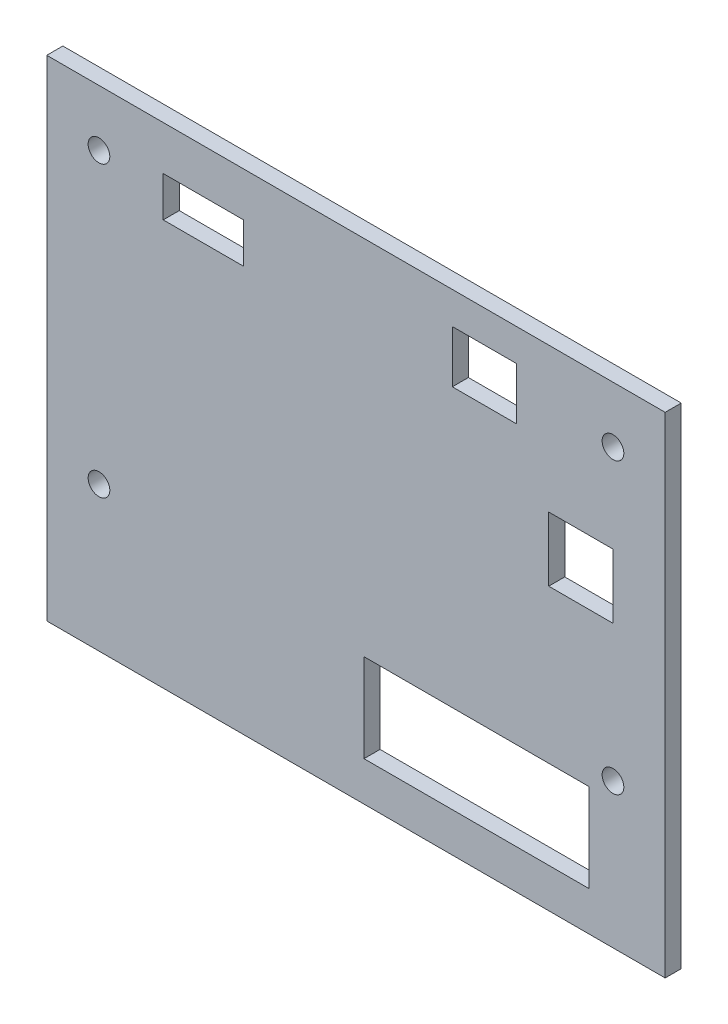
ISO-10303-21;
HEADER;
FILE_DESCRIPTION(('STEP AP214'),'2;1');
FILE_NAME('part.step','',(''),(''),'','','');
FILE_SCHEMA(('AUTOMOTIVE_DESIGN { 1 0 10303 214 1 1 1 1 }'));
ENDSEC;
DATA;
#1=APPLICATION_CONTEXT('core data for automotive mechanical design processes');
#2=APPLICATION_PROTOCOL_DEFINITION('international standard','automotive_design',2000,#1);
#3=PRODUCT_CONTEXT('',#1,'mechanical');
#4=PRODUCT('Part','Part','',(#3));
#5=PRODUCT_RELATED_PRODUCT_CATEGORY('part','',(#4));
#6=PRODUCT_DEFINITION_FORMATION('','',#4);
#7=PRODUCT_DEFINITION_CONTEXT('part definition',#1,'design');
#8=PRODUCT_DEFINITION('design','',#6,#7);
#9=PRODUCT_DEFINITION_SHAPE('','',#8);
#10=(LENGTH_UNIT() NAMED_UNIT(*) SI_UNIT(.MILLI.,.METRE.));
#11=(NAMED_UNIT(*) PLANE_ANGLE_UNIT() SI_UNIT($,.RADIAN.));
#12=(NAMED_UNIT(*) SI_UNIT($,.STERADIAN.) SOLID_ANGLE_UNIT());
#13=UNCERTAINTY_MEASURE_WITH_UNIT(LENGTH_MEASURE(1.E-05),#10,'distance_accuracy_value','');
#14=(GEOMETRIC_REPRESENTATION_CONTEXT(3) GLOBAL_UNCERTAINTY_ASSIGNED_CONTEXT((#13)) GLOBAL_UNIT_ASSIGNED_CONTEXT((#10,
#11,#12)) REPRESENTATION_CONTEXT('',''));
#15=CARTESIAN_POINT('',(0.,0.,0.));
#16=DIRECTION('',(0.,0.,1.));
#17=DIRECTION('',(1.,0.,0.));
#18=AXIS2_PLACEMENT_3D('',#15,#16,#17);
#19=CARTESIAN_POINT('',(0.,0.,2.));
#20=DIRECTION('',(0.,0.,-1.));
#21=DIRECTION('',(-1.,0.,0.));
#22=AXIS2_PLACEMENT_3D('',#19,#20,#21);
#23=PLANE('',#22);
#24=CARTESIAN_POINT('',(70.5,18.,2.));
#25=DIRECTION('',(0.,0.,1.));
#26=DIRECTION('',(1.,0.,0.));
#27=AXIS2_PLACEMENT_3D('',#24,#25,#26);
#28=CIRCLE('',#27,1.35000000000001);
#29=CARTESIAN_POINT('',(71.85,18.,2.));
#30=VERTEX_POINT('',#29);
#31=EDGE_CURVE('E484',#30,#30,#28,.T.);
#32=ORIENTED_EDGE('',*,*,#31,.F.);
#33=EDGE_LOOP('',(#32));
#34=FACE_BOUND('',#33,.T.);
#35=CARTESIAN_POINT('',(6.5,54.,2.));
#36=DIRECTION('',(0.,0.,1.));
#37=DIRECTION('',(1.,0.,0.));
#38=AXIS2_PLACEMENT_3D('',#35,#36,#37);
#39=CIRCLE('',#38,1.35);
#40=CARTESIAN_POINT('',(7.85,54.,2.));
#41=VERTEX_POINT('',#40);
#42=EDGE_CURVE('E473',#41,#41,#39,.T.);
#43=ORIENTED_EDGE('',*,*,#42,.F.);
#44=EDGE_LOOP('',(#43));
#45=FACE_BOUND('',#44,.T.);
#46=CARTESIAN_POINT('',(70.5,54.,2.));
#47=DIRECTION('',(0.,0.,1.));
#48=DIRECTION('',(1.,0.,0.));
#49=AXIS2_PLACEMENT_3D('',#46,#47,#48);
#50=CIRCLE('',#49,1.35000000000001);
#51=CARTESIAN_POINT('',(71.85,54.,2.));
#52=VERTEX_POINT('',#51);
#53=EDGE_CURVE('E468',#52,#52,#50,.T.);
#54=ORIENTED_EDGE('',*,*,#53,.F.);
#55=EDGE_LOOP('',(#54));
#56=FACE_BOUND('',#55,.T.);
#57=CARTESIAN_POINT('',(6.5,18.,2.));
#58=DIRECTION('',(0.,0.,1.));
#59=DIRECTION('',(1.,0.,0.));
#60=AXIS2_PLACEMENT_3D('',#57,#58,#59);
#61=CIRCLE('',#60,1.35);
#62=CARTESIAN_POINT('',(7.85,18.,2.));
#63=VERTEX_POINT('',#62);
#64=EDGE_CURVE('E251',#63,#63,#61,.T.);
#65=ORIENTED_EDGE('',*,*,#64,.F.);
#66=EDGE_LOOP('',(#65));
#67=FACE_BOUND('',#66,.T.);
#68=DIRECTION('',(0.,-1.,0.));
#69=VECTOR('',#68,1.);
#70=CARTESIAN_POINT('',(50.5,50.5,2.));
#71=LINE('',#70,#69);
#72=CARTESIAN_POINT('',(50.5,57.,2.));
#73=VERTEX_POINT('',#72);
#74=CARTESIAN_POINT('',(50.5,50.5,2.));
#75=VERTEX_POINT('',#74);
#76=EDGE_CURVE('E233',#73,#75,#71,.T.);
#77=ORIENTED_EDGE('',*,*,#76,.F.);
#78=DIRECTION('',(-1.,0.,0.));
#79=VECTOR('',#78,1.);
#80=CARTESIAN_POINT('',(50.5,57.,2.));
#81=LINE('',#80,#79);
#82=CARTESIAN_POINT('',(58.5,57.,2.));
#83=VERTEX_POINT('',#82);
#84=EDGE_CURVE('E228',#83,#73,#81,.T.);
#85=ORIENTED_EDGE('',*,*,#84,.F.);
#86=DIRECTION('',(0.,1.,0.));
#87=VECTOR('',#86,1.);
#88=CARTESIAN_POINT('',(58.5,50.5,2.));
#89=LINE('',#88,#87);
#90=CARTESIAN_POINT('',(58.5,50.5,2.));
#91=VERTEX_POINT('',#90);
#92=EDGE_CURVE('E242',#91,#83,#89,.T.);
#93=ORIENTED_EDGE('',*,*,#92,.F.);
#94=DIRECTION('',(1.,0.,0.));
#95=VECTOR('',#94,1.);
#96=CARTESIAN_POINT('',(50.5,50.5,2.));
#97=LINE('',#96,#95);
#98=EDGE_CURVE('E244',#75,#91,#97,.T.);
#99=ORIENTED_EDGE('',*,*,#98,.F.);
#100=EDGE_LOOP('',(#77,#85,#93,#99));
#101=FACE_BOUND('',#100,.T.);
#102=DIRECTION('',(0.,-1.,0.));
#103=VECTOR('',#102,1.);
#104=CARTESIAN_POINT('',(39.5,4.9,2.));
#105=LINE('',#104,#103);
#106=CARTESIAN_POINT('',(39.5,15.9,2.));
#107=VERTEX_POINT('',#106);
#108=CARTESIAN_POINT('',(39.5,4.9,2.));
#109=VERTEX_POINT('',#108);
#110=EDGE_CURVE('E278',#107,#109,#105,.T.);
#111=ORIENTED_EDGE('',*,*,#110,.F.);
#112=DIRECTION('',(-1.,0.,0.));
#113=VECTOR('',#112,1.);
#114=CARTESIAN_POINT('',(39.5,15.9,2.));
#115=LINE('',#114,#113);
#116=CARTESIAN_POINT('',(67.5,15.9,2.));
#117=VERTEX_POINT('',#116);
#118=EDGE_CURVE('E286',#117,#107,#115,.T.);
#119=ORIENTED_EDGE('',*,*,#118,.F.);
#120=DIRECTION('',(0.,1.,0.));
#121=VECTOR('',#120,1.);
#122=CARTESIAN_POINT('',(67.5,4.9,2.));
#123=LINE('',#122,#121);
#124=CARTESIAN_POINT('',(67.5,4.9,2.));
#125=VERTEX_POINT('',#124);
#126=EDGE_CURVE('E283',#125,#117,#123,.T.);
#127=ORIENTED_EDGE('',*,*,#126,.F.);
#128=DIRECTION('',(1.,0.,0.));
#129=VECTOR('',#128,1.);
#130=CARTESIAN_POINT('',(39.5,4.9,2.));
#131=LINE('',#130,#129);
#132=EDGE_CURVE('E280',#109,#125,#131,.T.);
#133=ORIENTED_EDGE('',*,*,#132,.F.);
#134=EDGE_LOOP('',(#111,#119,#127,#133));
#135=FACE_BOUND('',#134,.T.);
#136=DIRECTION('',(0.,-1.,0.));
#137=VECTOR('',#136,1.);
#138=CARTESIAN_POINT('',(0.,0.,2.));
#139=LINE('',#138,#137);
#140=CARTESIAN_POINT('',(0.,61.,2.));
#141=VERTEX_POINT('',#140);
#142=CARTESIAN_POINT('',(0.,0.,2.));
#143=VERTEX_POINT('',#142);
#144=EDGE_CURVE('E309',#141,#143,#139,.T.);
#145=ORIENTED_EDGE('',*,*,#144,.T.);
#146=DIRECTION('',(1.,0.,0.));
#147=VECTOR('',#146,1.);
#148=CARTESIAN_POINT('',(0.,0.,2.));
#149=LINE('',#148,#147);
#150=CARTESIAN_POINT('',(77.,0.,2.));
#151=VERTEX_POINT('',#150);
#152=EDGE_CURVE('E312',#143,#151,#149,.T.);
#153=ORIENTED_EDGE('',*,*,#152,.T.);
#154=DIRECTION('',(0.,1.,0.));
#155=VECTOR('',#154,1.);
#156=CARTESIAN_POINT('',(77.,0.,2.));
#157=LINE('',#156,#155);
#158=CARTESIAN_POINT('',(77.,61.,2.));
#159=VERTEX_POINT('',#158);
#160=EDGE_CURVE('E315',#151,#159,#157,.T.);
#161=ORIENTED_EDGE('',*,*,#160,.T.);
#162=DIRECTION('',(-1.,0.,0.));
#163=VECTOR('',#162,1.);
#164=CARTESIAN_POINT('',(0.,61.,2.));
#165=LINE('',#164,#163);
#166=EDGE_CURVE('E317',#159,#141,#165,.T.);
#167=ORIENTED_EDGE('',*,*,#166,.T.);
#168=EDGE_LOOP('',(#145,#153,#161,#167));
#169=FACE_BOUND('',#168,.T.);
#170=DIRECTION('',(0.,-1.,0.));
#171=VECTOR('',#170,1.);
#172=CARTESIAN_POINT('',(62.5,35.,2.));
#173=LINE('',#172,#171);
#174=CARTESIAN_POINT('',(62.5,43.,2.));
#175=VERTEX_POINT('',#174);
#176=CARTESIAN_POINT('',(62.5,35.,2.));
#177=VERTEX_POINT('',#176);
#178=EDGE_CURVE('E263',#175,#177,#173,.T.);
#179=ORIENTED_EDGE('',*,*,#178,.F.);
#180=DIRECTION('',(-1.,0.,0.));
#181=VECTOR('',#180,1.);
#182=CARTESIAN_POINT('',(62.5,43.,2.));
#183=LINE('',#182,#181);
#184=CARTESIAN_POINT('',(70.5,43.,2.));
#185=VERTEX_POINT('',#184);
#186=EDGE_CURVE('E258',#185,#175,#183,.T.);
#187=ORIENTED_EDGE('',*,*,#186,.F.);
#188=DIRECTION('',(0.,1.,0.));
#189=VECTOR('',#188,1.);
#190=CARTESIAN_POINT('',(70.5,35.,2.));
#191=LINE('',#190,#189);
#192=CARTESIAN_POINT('',(70.5,35.,2.));
#193=VERTEX_POINT('',#192);
#194=EDGE_CURVE('E272',#193,#185,#191,.T.);
#195=ORIENTED_EDGE('',*,*,#194,.F.);
#196=DIRECTION('',(1.,0.,0.));
#197=VECTOR('',#196,1.);
#198=CARTESIAN_POINT('',(62.5,35.,2.));
#199=LINE('',#198,#197);
#200=EDGE_CURVE('E275',#177,#193,#199,.T.);
#201=ORIENTED_EDGE('',*,*,#200,.F.);
#202=EDGE_LOOP('',(#179,#187,#195,#201));
#203=FACE_BOUND('',#202,.T.);
#204=DIRECTION('',(0.,-1.,0.));
#205=VECTOR('',#204,1.);
#206=CARTESIAN_POINT('',(14.5,50.5,2.));
#207=LINE('',#206,#205);
#208=CARTESIAN_POINT('',(14.5,55.5,2.));
#209=VERTEX_POINT('',#208);
#210=CARTESIAN_POINT('',(14.5,50.5,2.));
#211=VERTEX_POINT('',#210);
#212=EDGE_CURVE('E177',#209,#211,#207,.T.);
#213=ORIENTED_EDGE('',*,*,#212,.F.);
#214=DIRECTION('',(-1.,0.,0.));
#215=VECTOR('',#214,1.);
#216=CARTESIAN_POINT('',(14.5,55.5,2.));
#217=LINE('',#216,#215);
#218=CARTESIAN_POINT('',(24.5,55.5,2.));
#219=VERTEX_POINT('',#218);
#220=EDGE_CURVE('E201',#219,#209,#217,.T.);
#221=ORIENTED_EDGE('',*,*,#220,.F.);
#222=DIRECTION('',(0.,1.,0.));
#223=VECTOR('',#222,1.);
#224=CARTESIAN_POINT('',(24.5,50.5,2.));
#225=LINE('',#224,#223);
#226=CARTESIAN_POINT('',(24.5,50.5,2.));
#227=VERTEX_POINT('',#226);
#228=EDGE_CURVE('E199',#227,#219,#225,.T.);
#229=ORIENTED_EDGE('',*,*,#228,.F.);
#230=DIRECTION('',(1.,0.,0.));
#231=VECTOR('',#230,1.);
#232=CARTESIAN_POINT('',(14.5,50.5,2.));
#233=LINE('',#232,#231);
#234=EDGE_CURVE('E187',#211,#227,#233,.T.);
#235=ORIENTED_EDGE('',*,*,#234,.F.);
#236=EDGE_LOOP('',(#213,#221,#229,#235));
#237=FACE_BOUND('',#236,.T.);
#238=ADVANCED_FACE('F39',(#34,#45,#56,#67,#101,#135,#169,#203,#237),#23,.F.);
#239=CARTESIAN_POINT('',(0.,0.,0.));
#240=DIRECTION('',(0.,0.,-1.));
#241=DIRECTION('',(-1.,0.,0.));
#242=AXIS2_PLACEMENT_3D('',#239,#240,#241);
#243=PLANE('',#242);
#244=CARTESIAN_POINT('',(70.5,18.,0.));
#245=DIRECTION('',(0.,0.,1.));
#246=DIRECTION('',(1.,0.,0.));
#247=AXIS2_PLACEMENT_3D('',#244,#245,#246);
#248=CIRCLE('',#247,1.35000000000001);
#249=CARTESIAN_POINT('',(71.85,18.,0.));
#250=VERTEX_POINT('',#249);
#251=EDGE_CURVE('E480',#250,#250,#248,.T.);
#252=ORIENTED_EDGE('',*,*,#251,.T.);
#253=EDGE_LOOP('',(#252));
#254=FACE_BOUND('',#253,.T.);
#255=CARTESIAN_POINT('',(6.5,54.,0.));
#256=DIRECTION('',(0.,0.,1.));
#257=DIRECTION('',(1.,0.,0.));
#258=AXIS2_PLACEMENT_3D('',#255,#256,#257);
#259=CIRCLE('',#258,1.35);
#260=CARTESIAN_POINT('',(7.85,54.,0.));
#261=VERTEX_POINT('',#260);
#262=EDGE_CURVE('E476',#261,#261,#259,.T.);
#263=ORIENTED_EDGE('',*,*,#262,.T.);
#264=EDGE_LOOP('',(#263));
#265=FACE_BOUND('',#264,.T.);
#266=CARTESIAN_POINT('',(70.5,54.,0.));
#267=DIRECTION('',(0.,0.,1.));
#268=DIRECTION('',(1.,0.,0.));
#269=AXIS2_PLACEMENT_3D('',#266,#267,#268);
#270=CIRCLE('',#269,1.35000000000001);
#271=CARTESIAN_POINT('',(71.85,54.,0.));
#272=VERTEX_POINT('',#271);
#273=EDGE_CURVE('E471',#272,#272,#270,.T.);
#274=ORIENTED_EDGE('',*,*,#273,.T.);
#275=EDGE_LOOP('',(#274));
#276=FACE_BOUND('',#275,.T.);
#277=CARTESIAN_POINT('',(6.5,18.,0.));
#278=DIRECTION('',(0.,0.,1.));
#279=DIRECTION('',(1.,0.,0.));
#280=AXIS2_PLACEMENT_3D('',#277,#278,#279);
#281=CIRCLE('',#280,1.35);
#282=CARTESIAN_POINT('',(7.85,18.,0.));
#283=VERTEX_POINT('',#282);
#284=EDGE_CURVE('E483',#283,#283,#281,.T.);
#285=ORIENTED_EDGE('',*,*,#284,.T.);
#286=EDGE_LOOP('',(#285));
#287=FACE_BOUND('',#286,.T.);
#288=DIRECTION('',(0.,-1.,0.));
#289=VECTOR('',#288,1.);
#290=CARTESIAN_POINT('',(0.,0.,0.));
#291=LINE('',#290,#289);
#292=CARTESIAN_POINT('',(0.,61.,0.));
#293=VERTEX_POINT('',#292);
#294=CARTESIAN_POINT('',(0.,0.,0.));
#295=VERTEX_POINT('',#294);
#296=EDGE_CURVE('E308',#293,#295,#291,.T.);
#297=ORIENTED_EDGE('',*,*,#296,.F.);
#298=DIRECTION('',(-1.,0.,0.));
#299=VECTOR('',#298,1.);
#300=CARTESIAN_POINT('',(0.,61.,0.));
#301=LINE('',#300,#299);
#302=CARTESIAN_POINT('',(77.,61.,0.));
#303=VERTEX_POINT('',#302);
#304=EDGE_CURVE('E313',#303,#293,#301,.T.);
#305=ORIENTED_EDGE('',*,*,#304,.F.);
#306=DIRECTION('',(0.,1.,0.));
#307=VECTOR('',#306,1.);
#308=CARTESIAN_POINT('',(77.,0.,0.));
#309=LINE('',#308,#307);
#310=CARTESIAN_POINT('',(77.,0.,0.));
#311=VERTEX_POINT('',#310);
#312=EDGE_CURVE('E324',#311,#303,#309,.T.);
#313=ORIENTED_EDGE('',*,*,#312,.F.);
#314=DIRECTION('',(1.,0.,0.));
#315=VECTOR('',#314,1.);
#316=CARTESIAN_POINT('',(0.,0.,0.));
#317=LINE('',#316,#315);
#318=EDGE_CURVE('E322',#295,#311,#317,.T.);
#319=ORIENTED_EDGE('',*,*,#318,.F.);
#320=EDGE_LOOP('',(#297,#305,#313,#319));
#321=FACE_BOUND('',#320,.T.);
#322=DIRECTION('',(-1.,0.,0.));
#323=VECTOR('',#322,1.);
#324=CARTESIAN_POINT('',(39.5,15.9,0.));
#325=LINE('',#324,#323);
#326=CARTESIAN_POINT('',(67.5,15.9,0.));
#327=VERTEX_POINT('',#326);
#328=CARTESIAN_POINT('',(39.5,15.9,0.));
#329=VERTEX_POINT('',#328);
#330=EDGE_CURVE('E281',#327,#329,#325,.T.);
#331=ORIENTED_EDGE('',*,*,#330,.T.);
#332=DIRECTION('',(0.,-1.,0.));
#333=VECTOR('',#332,1.);
#334=CARTESIAN_POINT('',(39.5,4.9,0.));
#335=LINE('',#334,#333);
#336=CARTESIAN_POINT('',(39.5,4.9,0.));
#337=VERTEX_POINT('',#336);
#338=EDGE_CURVE('E195',#329,#337,#335,.T.);
#339=ORIENTED_EDGE('',*,*,#338,.T.);
#340=DIRECTION('',(1.,0.,0.));
#341=VECTOR('',#340,1.);
#342=CARTESIAN_POINT('',(39.5,4.9,0.));
#343=LINE('',#342,#341);
#344=CARTESIAN_POINT('',(67.5,4.9,0.));
#345=VERTEX_POINT('',#344);
#346=EDGE_CURVE('E291',#337,#345,#343,.T.);
#347=ORIENTED_EDGE('',*,*,#346,.T.);
#348=DIRECTION('',(0.,1.,0.));
#349=VECTOR('',#348,1.);
#350=CARTESIAN_POINT('',(67.5,4.9,0.));
#351=LINE('',#350,#349);
#352=EDGE_CURVE('E294',#345,#327,#351,.T.);
#353=ORIENTED_EDGE('',*,*,#352,.T.);
#354=EDGE_LOOP('',(#331,#339,#347,#353));
#355=FACE_BOUND('',#354,.T.);
#356=DIRECTION('',(-1.,0.,0.));
#357=VECTOR('',#356,1.);
#358=CARTESIAN_POINT('',(62.5,43.,0.));
#359=LINE('',#358,#357);
#360=CARTESIAN_POINT('',(70.5,43.,0.));
#361=VERTEX_POINT('',#360);
#362=CARTESIAN_POINT('',(62.5,43.,0.));
#363=VERTEX_POINT('',#362);
#364=EDGE_CURVE('E259',#361,#363,#359,.T.);
#365=ORIENTED_EDGE('',*,*,#364,.T.);
#366=DIRECTION('',(0.,-1.,0.));
#367=VECTOR('',#366,1.);
#368=CARTESIAN_POINT('',(62.5,35.,0.));
#369=LINE('',#368,#367);
#370=CARTESIAN_POINT('',(62.5,35.,0.));
#371=VERTEX_POINT('',#370);
#372=EDGE_CURVE('E222',#363,#371,#369,.T.);
#373=ORIENTED_EDGE('',*,*,#372,.T.);
#374=DIRECTION('',(1.,0.,0.));
#375=VECTOR('',#374,1.);
#376=CARTESIAN_POINT('',(62.5,35.,0.));
#377=LINE('',#376,#375);
#378=CARTESIAN_POINT('',(70.5,35.,0.));
#379=VERTEX_POINT('',#378);
#380=EDGE_CURVE('E266',#371,#379,#377,.T.);
#381=ORIENTED_EDGE('',*,*,#380,.T.);
#382=DIRECTION('',(0.,1.,0.));
#383=VECTOR('',#382,1.);
#384=CARTESIAN_POINT('',(70.5,35.,0.));
#385=LINE('',#384,#383);
#386=EDGE_CURVE('E262',#379,#361,#385,.T.);
#387=ORIENTED_EDGE('',*,*,#386,.T.);
#388=EDGE_LOOP('',(#365,#373,#381,#387));
#389=FACE_BOUND('',#388,.T.);
#390=DIRECTION('',(-1.,0.,0.));
#391=VECTOR('',#390,1.);
#392=CARTESIAN_POINT('',(50.5,57.,0.));
#393=LINE('',#392,#391);
#394=CARTESIAN_POINT('',(58.5,57.,0.));
#395=VERTEX_POINT('',#394);
#396=CARTESIAN_POINT('',(50.5,57.,0.));
#397=VERTEX_POINT('',#396);
#398=EDGE_CURVE('E229',#395,#397,#393,.T.);
#399=ORIENTED_EDGE('',*,*,#398,.T.);
#400=DIRECTION('',(0.,-1.,0.));
#401=VECTOR('',#400,1.);
#402=CARTESIAN_POINT('',(50.5,50.5,0.));
#403=LINE('',#402,#401);
#404=CARTESIAN_POINT('',(50.5,50.5,0.));
#405=VERTEX_POINT('',#404);
#406=EDGE_CURVE('E208',#397,#405,#403,.T.);
#407=ORIENTED_EDGE('',*,*,#406,.T.);
#408=DIRECTION('',(1.,0.,0.));
#409=VECTOR('',#408,1.);
#410=CARTESIAN_POINT('',(50.5,50.5,0.));
#411=LINE('',#410,#409);
#412=CARTESIAN_POINT('',(58.5,50.5,0.));
#413=VERTEX_POINT('',#412);
#414=EDGE_CURVE('E236',#405,#413,#411,.T.);
#415=ORIENTED_EDGE('',*,*,#414,.T.);
#416=DIRECTION('',(0.,1.,0.));
#417=VECTOR('',#416,1.);
#418=CARTESIAN_POINT('',(58.5,50.5,0.));
#419=LINE('',#418,#417);
#420=EDGE_CURVE('E232',#413,#395,#419,.T.);
#421=ORIENTED_EDGE('',*,*,#420,.T.);
#422=EDGE_LOOP('',(#399,#407,#415,#421));
#423=FACE_BOUND('',#422,.T.);
#424=DIRECTION('',(-1.,0.,0.));
#425=VECTOR('',#424,1.);
#426=CARTESIAN_POINT('',(14.5,55.5,0.));
#427=LINE('',#426,#425);
#428=CARTESIAN_POINT('',(24.5,55.5,0.));
#429=VERTEX_POINT('',#428);
#430=CARTESIAN_POINT('',(14.5,55.5,0.));
#431=VERTEX_POINT('',#430);
#432=EDGE_CURVE('E188',#429,#431,#427,.T.);
#433=ORIENTED_EDGE('',*,*,#432,.T.);
#434=DIRECTION('',(0.,-1.,0.));
#435=VECTOR('',#434,1.);
#436=CARTESIAN_POINT('',(14.5,50.5,0.));
#437=LINE('',#436,#435);
#438=CARTESIAN_POINT('',(14.5,50.5,0.));
#439=VERTEX_POINT('',#438);
#440=EDGE_CURVE('E206',#431,#439,#437,.T.);
#441=ORIENTED_EDGE('',*,*,#440,.T.);
#442=DIRECTION('',(1.,0.,0.));
#443=VECTOR('',#442,1.);
#444=CARTESIAN_POINT('',(14.5,50.5,0.));
#445=LINE('',#444,#443);
#446=CARTESIAN_POINT('',(24.5,50.5,0.));
#447=VERTEX_POINT('',#446);
#448=EDGE_CURVE('E194',#439,#447,#445,.T.);
#449=ORIENTED_EDGE('',*,*,#448,.T.);
#450=DIRECTION('',(0.,1.,0.));
#451=VECTOR('',#450,1.);
#452=CARTESIAN_POINT('',(24.5,50.5,0.));
#453=LINE('',#452,#451);
#454=EDGE_CURVE('E210',#447,#429,#453,.T.);
#455=ORIENTED_EDGE('',*,*,#454,.T.);
#456=EDGE_LOOP('',(#433,#441,#449,#455));
#457=FACE_BOUND('',#456,.T.);
#458=ADVANCED_FACE('F342',(#254,#265,#276,#287,#321,#355,#389,#423,#457),#243,.T.);
#459=CARTESIAN_POINT('',(0.,0.,2.));
#460=DIRECTION('',(1.,0.,0.));
#461=DIRECTION('',(0.,0.,-1.));
#462=AXIS2_PLACEMENT_3D('',#459,#460,#461);
#463=PLANE('',#462);
#464=ORIENTED_EDGE('',*,*,#296,.T.);
#465=DIRECTION('',(0.,0.,-1.));
#466=VECTOR('',#465,1.);
#467=CARTESIAN_POINT('',(0.,0.,2.));
#468=LINE('',#467,#466);
#469=EDGE_CURVE('E11',#143,#295,#468,.T.);
#470=ORIENTED_EDGE('',*,*,#469,.F.);
#471=ORIENTED_EDGE('',*,*,#144,.F.);
#472=DIRECTION('',(0.,0.,-1.));
#473=VECTOR('',#472,1.);
#474=CARTESIAN_POINT('',(0.,61.,2.));
#475=LINE('',#474,#473);
#476=EDGE_CURVE('E319',#141,#293,#475,.T.);
#477=ORIENTED_EDGE('',*,*,#476,.T.);
#478=EDGE_LOOP('',(#464,#470,#471,#477));
#479=FACE_BOUND('',#478,.T.);
#480=ADVANCED_FACE('F41',(#479),#463,.F.);
#481=CARTESIAN_POINT('',(0.,0.,2.));
#482=DIRECTION('',(0.,1.,0.));
#483=DIRECTION('',(0.,0.,1.));
#484=AXIS2_PLACEMENT_3D('',#481,#482,#483);
#485=PLANE('',#484);
#486=ORIENTED_EDGE('',*,*,#318,.T.);
#487=DIRECTION('',(0.,0.,-1.));
#488=VECTOR('',#487,1.);
#489=CARTESIAN_POINT('',(77.,0.,2.));
#490=LINE('',#489,#488);
#491=EDGE_CURVE('E47',#151,#311,#490,.T.);
#492=ORIENTED_EDGE('',*,*,#491,.F.);
#493=ORIENTED_EDGE('',*,*,#152,.F.);
#494=ORIENTED_EDGE('',*,*,#469,.T.);
#495=EDGE_LOOP('',(#486,#492,#493,#494));
#496=FACE_BOUND('',#495,.T.);
#497=ADVANCED_FACE('F353',(#496),#485,.F.);
#498=CARTESIAN_POINT('',(77.,0.,2.));
#499=DIRECTION('',(-1.,0.,0.));
#500=DIRECTION('',(0.,0.,1.));
#501=AXIS2_PLACEMENT_3D('',#498,#499,#500);
#502=PLANE('',#501);
#503=ORIENTED_EDGE('',*,*,#312,.T.);
#504=DIRECTION('',(0.,0.,-1.));
#505=VECTOR('',#504,1.);
#506=CARTESIAN_POINT('',(77.,61.,2.));
#507=LINE('',#506,#505);
#508=EDGE_CURVE('E329',#159,#303,#507,.T.);
#509=ORIENTED_EDGE('',*,*,#508,.F.);
#510=ORIENTED_EDGE('',*,*,#160,.F.);
#511=ORIENTED_EDGE('',*,*,#491,.T.);
#512=EDGE_LOOP('',(#503,#509,#510,#511));
#513=FACE_BOUND('',#512,.T.);
#514=ADVANCED_FACE('F336',(#513),#502,.F.);
#515=CARTESIAN_POINT('',(0.,61.,2.));
#516=DIRECTION('',(0.,-1.,0.));
#517=DIRECTION('',(0.,0.,-1.));
#518=AXIS2_PLACEMENT_3D('',#515,#516,#517);
#519=PLANE('',#518);
#520=ORIENTED_EDGE('',*,*,#304,.T.);
#521=ORIENTED_EDGE('',*,*,#476,.F.);
#522=ORIENTED_EDGE('',*,*,#166,.F.);
#523=ORIENTED_EDGE('',*,*,#508,.T.);
#524=EDGE_LOOP('',(#520,#521,#522,#523));
#525=FACE_BOUND('',#524,.T.);
#526=ADVANCED_FACE('F346',(#525),#519,.F.);
#527=CARTESIAN_POINT('',(39.5,4.9,2.));
#528=DIRECTION('',(1.,0.,0.));
#529=DIRECTION('',(0.,0.,-1.));
#530=AXIS2_PLACEMENT_3D('',#527,#528,#529);
#531=PLANE('',#530);
#532=ORIENTED_EDGE('',*,*,#338,.F.);
#533=DIRECTION('',(0.,0.,-1.));
#534=VECTOR('',#533,1.);
#535=CARTESIAN_POINT('',(39.5,15.9,2.));
#536=LINE('',#535,#534);
#537=EDGE_CURVE('E288',#107,#329,#536,.T.);
#538=ORIENTED_EDGE('',*,*,#537,.F.);
#539=ORIENTED_EDGE('',*,*,#110,.T.);
#540=DIRECTION('',(0.,0.,-1.));
#541=VECTOR('',#540,1.);
#542=CARTESIAN_POINT('',(39.5,4.9,2.));
#543=LINE('',#542,#541);
#544=EDGE_CURVE('E305',#109,#337,#543,.T.);
#545=ORIENTED_EDGE('',*,*,#544,.T.);
#546=EDGE_LOOP('',(#532,#538,#539,#545));
#547=FACE_BOUND('',#546,.T.);
#548=ADVANCED_FACE('F371',(#547),#531,.T.);
#549=CARTESIAN_POINT('',(39.5,4.9,2.));
#550=DIRECTION('',(0.,1.,0.));
#551=DIRECTION('',(0.,0.,1.));
#552=AXIS2_PLACEMENT_3D('',#549,#550,#551);
#553=PLANE('',#552);
#554=ORIENTED_EDGE('',*,*,#346,.F.);
#555=ORIENTED_EDGE('',*,*,#544,.F.);
#556=ORIENTED_EDGE('',*,*,#132,.T.);
#557=DIRECTION('',(0.,0.,-1.));
#558=VECTOR('',#557,1.);
#559=CARTESIAN_POINT('',(67.5,4.9,2.));
#560=LINE('',#559,#558);
#561=EDGE_CURVE('E303',#125,#345,#560,.T.);
#562=ORIENTED_EDGE('',*,*,#561,.T.);
#563=EDGE_LOOP('',(#554,#555,#556,#562));
#564=FACE_BOUND('',#563,.T.);
#565=ADVANCED_FACE('F378',(#564),#553,.T.);
#566=CARTESIAN_POINT('',(67.5,4.9,2.));
#567=DIRECTION('',(-1.,0.,0.));
#568=DIRECTION('',(0.,0.,1.));
#569=AXIS2_PLACEMENT_3D('',#566,#567,#568);
#570=PLANE('',#569);
#571=ORIENTED_EDGE('',*,*,#352,.F.);
#572=ORIENTED_EDGE('',*,*,#561,.F.);
#573=ORIENTED_EDGE('',*,*,#126,.T.);
#574=DIRECTION('',(0.,0.,-1.));
#575=VECTOR('',#574,1.);
#576=CARTESIAN_POINT('',(67.5,15.9,2.));
#577=LINE('',#576,#575);
#578=EDGE_CURVE('E301',#117,#327,#577,.T.);
#579=ORIENTED_EDGE('',*,*,#578,.T.);
#580=EDGE_LOOP('',(#571,#572,#573,#579));
#581=FACE_BOUND('',#580,.T.);
#582=ADVANCED_FACE('F383',(#581),#570,.T.);
#583=CARTESIAN_POINT('',(39.5,15.9,2.));
#584=DIRECTION('',(0.,-1.,0.));
#585=DIRECTION('',(0.,0.,-1.));
#586=AXIS2_PLACEMENT_3D('',#583,#584,#585);
#587=PLANE('',#586);
#588=ORIENTED_EDGE('',*,*,#330,.F.);
#589=ORIENTED_EDGE('',*,*,#578,.F.);
#590=ORIENTED_EDGE('',*,*,#118,.T.);
#591=ORIENTED_EDGE('',*,*,#537,.T.);
#592=EDGE_LOOP('',(#588,#589,#590,#591));
#593=FACE_BOUND('',#592,.T.);
#594=ADVANCED_FACE('F390',(#593),#587,.T.);
#595=CARTESIAN_POINT('',(62.5,35.,2.));
#596=DIRECTION('',(1.,0.,0.));
#597=DIRECTION('',(0.,0.,-1.));
#598=AXIS2_PLACEMENT_3D('',#595,#596,#597);
#599=PLANE('',#598);
#600=ORIENTED_EDGE('',*,*,#372,.F.);
#601=DIRECTION('',(0.,0.,-1.));
#602=VECTOR('',#601,1.);
#603=CARTESIAN_POINT('',(62.5,43.,2.));
#604=LINE('',#603,#602);
#605=EDGE_CURVE('E255',#175,#363,#604,.T.);
#606=ORIENTED_EDGE('',*,*,#605,.F.);
#607=ORIENTED_EDGE('',*,*,#178,.T.);
#608=DIRECTION('',(0.,0.,-1.));
#609=VECTOR('',#608,1.);
#610=CARTESIAN_POINT('',(62.5,35.,2.));
#611=LINE('',#610,#609);
#612=EDGE_CURVE('E247',#177,#371,#611,.T.);
#613=ORIENTED_EDGE('',*,*,#612,.T.);
#614=EDGE_LOOP('',(#600,#606,#607,#613));
#615=FACE_BOUND('',#614,.T.);
#616=ADVANCED_FACE('F404',(#615),#599,.T.);
#617=CARTESIAN_POINT('',(62.5,35.,2.));
#618=DIRECTION('',(0.,1.,0.));
#619=DIRECTION('',(0.,0.,1.));
#620=AXIS2_PLACEMENT_3D('',#617,#618,#619);
#621=PLANE('',#620);
#622=ORIENTED_EDGE('',*,*,#380,.F.);
#623=ORIENTED_EDGE('',*,*,#612,.F.);
#624=ORIENTED_EDGE('',*,*,#200,.T.);
#625=DIRECTION('',(0.,0.,-1.));
#626=VECTOR('',#625,1.);
#627=CARTESIAN_POINT('',(70.5,35.,2.));
#628=LINE('',#627,#626);
#629=EDGE_CURVE('E250',#193,#379,#628,.T.);
#630=ORIENTED_EDGE('',*,*,#629,.T.);
#631=EDGE_LOOP('',(#622,#623,#624,#630));
#632=FACE_BOUND('',#631,.T.);
#633=ADVANCED_FACE('F415',(#632),#621,.T.);
#634=CARTESIAN_POINT('',(70.5,35.,2.));
#635=DIRECTION('',(-1.,0.,0.));
#636=DIRECTION('',(0.,0.,1.));
#637=AXIS2_PLACEMENT_3D('',#634,#635,#636);
#638=PLANE('',#637);
#639=ORIENTED_EDGE('',*,*,#386,.F.);
#640=ORIENTED_EDGE('',*,*,#629,.F.);
#641=ORIENTED_EDGE('',*,*,#194,.T.);
#642=DIRECTION('',(0.,0.,-1.));
#643=VECTOR('',#642,1.);
#644=CARTESIAN_POINT('',(70.5,43.,2.));
#645=LINE('',#644,#643);
#646=EDGE_CURVE('E253',#185,#361,#645,.T.);
#647=ORIENTED_EDGE('',*,*,#646,.T.);
#648=EDGE_LOOP('',(#639,#640,#641,#647));
#649=FACE_BOUND('',#648,.T.);
#650=ADVANCED_FACE('F411',(#649),#638,.T.);
#651=CARTESIAN_POINT('',(62.5,43.,2.));
#652=DIRECTION('',(0.,-1.,0.));
#653=DIRECTION('',(0.,0.,-1.));
#654=AXIS2_PLACEMENT_3D('',#651,#652,#653);
#655=PLANE('',#654);
#656=ORIENTED_EDGE('',*,*,#364,.F.);
#657=ORIENTED_EDGE('',*,*,#646,.F.);
#658=ORIENTED_EDGE('',*,*,#186,.T.);
#659=ORIENTED_EDGE('',*,*,#605,.T.);
#660=EDGE_LOOP('',(#656,#657,#658,#659));
#661=FACE_BOUND('',#660,.T.);
#662=ADVANCED_FACE('F407',(#661),#655,.T.);
#663=CARTESIAN_POINT('',(50.5,50.5,2.));
#664=DIRECTION('',(1.,0.,0.));
#665=DIRECTION('',(0.,0.,-1.));
#666=AXIS2_PLACEMENT_3D('',#663,#664,#665);
#667=PLANE('',#666);
#668=ORIENTED_EDGE('',*,*,#406,.F.);
#669=DIRECTION('',(0.,0.,-1.));
#670=VECTOR('',#669,1.);
#671=CARTESIAN_POINT('',(50.5,57.,2.));
#672=LINE('',#671,#670);
#673=EDGE_CURVE('E225',#73,#397,#672,.T.);
#674=ORIENTED_EDGE('',*,*,#673,.F.);
#675=ORIENTED_EDGE('',*,*,#76,.T.);
#676=DIRECTION('',(0.,0.,-1.));
#677=VECTOR('',#676,1.);
#678=CARTESIAN_POINT('',(50.5,50.5,2.));
#679=LINE('',#678,#677);
#680=EDGE_CURVE('E218',#75,#405,#679,.T.);
#681=ORIENTED_EDGE('',*,*,#680,.T.);
#682=EDGE_LOOP('',(#668,#674,#675,#681));
#683=FACE_BOUND('',#682,.T.);
#684=ADVANCED_FACE('F410',(#683),#667,.T.);
#685=CARTESIAN_POINT('',(50.5,50.5,2.));
#686=DIRECTION('',(0.,1.,0.));
#687=DIRECTION('',(0.,0.,1.));
#688=AXIS2_PLACEMENT_3D('',#685,#686,#687);
#689=PLANE('',#688);
#690=ORIENTED_EDGE('',*,*,#414,.F.);
#691=ORIENTED_EDGE('',*,*,#680,.F.);
#692=ORIENTED_EDGE('',*,*,#98,.T.);
#693=DIRECTION('',(0.,0.,-1.));
#694=VECTOR('',#693,1.);
#695=CARTESIAN_POINT('',(58.5,50.5,2.));
#696=LINE('',#695,#694);
#697=EDGE_CURVE('E221',#91,#413,#696,.T.);
#698=ORIENTED_EDGE('',*,*,#697,.T.);
#699=EDGE_LOOP('',(#690,#691,#692,#698));
#700=FACE_BOUND('',#699,.T.);
#701=ADVANCED_FACE('F429',(#700),#689,.T.);
#702=CARTESIAN_POINT('',(58.5,50.5,2.));
#703=DIRECTION('',(-1.,0.,0.));
#704=DIRECTION('',(0.,0.,1.));
#705=AXIS2_PLACEMENT_3D('',#702,#703,#704);
#706=PLANE('',#705);
#707=ORIENTED_EDGE('',*,*,#420,.F.);
#708=ORIENTED_EDGE('',*,*,#697,.F.);
#709=ORIENTED_EDGE('',*,*,#92,.T.);
#710=DIRECTION('',(0.,0.,-1.));
#711=VECTOR('',#710,1.);
#712=CARTESIAN_POINT('',(58.5,57.,2.));
#713=LINE('',#712,#711);
#714=EDGE_CURVE('E62',#83,#395,#713,.T.);
#715=ORIENTED_EDGE('',*,*,#714,.T.);
#716=EDGE_LOOP('',(#707,#708,#709,#715));
#717=FACE_BOUND('',#716,.T.);
#718=ADVANCED_FACE('F426',(#717),#706,.T.);
#719=CARTESIAN_POINT('',(50.5,57.,2.));
#720=DIRECTION('',(0.,-1.,0.));
#721=DIRECTION('',(0.,0.,-1.));
#722=AXIS2_PLACEMENT_3D('',#719,#720,#721);
#723=PLANE('',#722);
#724=ORIENTED_EDGE('',*,*,#398,.F.);
#725=ORIENTED_EDGE('',*,*,#714,.F.);
#726=ORIENTED_EDGE('',*,*,#84,.T.);
#727=ORIENTED_EDGE('',*,*,#673,.T.);
#728=EDGE_LOOP('',(#724,#725,#726,#727));
#729=FACE_BOUND('',#728,.T.);
#730=ADVANCED_FACE('F423',(#729),#723,.T.);
#731=CARTESIAN_POINT('',(14.5,50.5,2.));
#732=DIRECTION('',(1.,0.,0.));
#733=DIRECTION('',(0.,0.,-1.));
#734=AXIS2_PLACEMENT_3D('',#731,#732,#733);
#735=PLANE('',#734);
#736=ORIENTED_EDGE('',*,*,#440,.F.);
#737=DIRECTION('',(0.,0.,-1.));
#738=VECTOR('',#737,1.);
#739=CARTESIAN_POINT('',(14.5,55.5,2.));
#740=LINE('',#739,#738);
#741=EDGE_CURVE('E183',#209,#431,#740,.T.);
#742=ORIENTED_EDGE('',*,*,#741,.F.);
#743=ORIENTED_EDGE('',*,*,#212,.T.);
#744=DIRECTION('',(0.,0.,-1.));
#745=VECTOR('',#744,1.);
#746=CARTESIAN_POINT('',(14.5,50.5,2.));
#747=LINE('',#746,#745);
#748=EDGE_CURVE('E180',#211,#439,#747,.T.);
#749=ORIENTED_EDGE('',*,*,#748,.T.);
#750=EDGE_LOOP('',(#736,#742,#743,#749));
#751=FACE_BOUND('',#750,.T.);
#752=ADVANCED_FACE('F179',(#751),#735,.T.);
#753=CARTESIAN_POINT('',(14.5,50.5,2.));
#754=DIRECTION('',(0.,1.,0.));
#755=DIRECTION('',(0.,0.,1.));
#756=AXIS2_PLACEMENT_3D('',#753,#754,#755);
#757=PLANE('',#756);
#758=ORIENTED_EDGE('',*,*,#448,.F.);
#759=ORIENTED_EDGE('',*,*,#748,.F.);
#760=ORIENTED_EDGE('',*,*,#234,.T.);
#761=DIRECTION('',(0.,0.,-1.));
#762=VECTOR('',#761,1.);
#763=CARTESIAN_POINT('',(24.5,50.5,2.));
#764=LINE('',#763,#762);
#765=EDGE_CURVE('E196',#227,#447,#764,.T.);
#766=ORIENTED_EDGE('',*,*,#765,.T.);
#767=EDGE_LOOP('',(#758,#759,#760,#766));
#768=FACE_BOUND('',#767,.T.);
#769=ADVANCED_FACE('F191',(#768),#757,.T.);
#770=CARTESIAN_POINT('',(24.5,50.5,2.));
#771=DIRECTION('',(-1.,0.,0.));
#772=DIRECTION('',(0.,0.,1.));
#773=AXIS2_PLACEMENT_3D('',#770,#771,#772);
#774=PLANE('',#773);
#775=ORIENTED_EDGE('',*,*,#454,.F.);
#776=ORIENTED_EDGE('',*,*,#765,.F.);
#777=ORIENTED_EDGE('',*,*,#228,.T.);
#778=DIRECTION('',(0.,0.,-1.));
#779=VECTOR('',#778,1.);
#780=CARTESIAN_POINT('',(24.5,55.5,2.));
#781=LINE('',#780,#779);
#782=EDGE_CURVE('E54',#219,#429,#781,.T.);
#783=ORIENTED_EDGE('',*,*,#782,.T.);
#784=EDGE_LOOP('',(#775,#776,#777,#783));
#785=FACE_BOUND('',#784,.T.);
#786=ADVANCED_FACE('F441',(#785),#774,.T.);
#787=CARTESIAN_POINT('',(14.5,55.5,2.));
#788=DIRECTION('',(0.,-1.,0.));
#789=DIRECTION('',(0.,0.,-1.));
#790=AXIS2_PLACEMENT_3D('',#787,#788,#789);
#791=PLANE('',#790);
#792=ORIENTED_EDGE('',*,*,#432,.F.);
#793=ORIENTED_EDGE('',*,*,#782,.F.);
#794=ORIENTED_EDGE('',*,*,#220,.T.);
#795=ORIENTED_EDGE('',*,*,#741,.T.);
#796=EDGE_LOOP('',(#792,#793,#794,#795));
#797=FACE_BOUND('',#796,.T.);
#798=ADVANCED_FACE('F444',(#797),#791,.T.);
#799=CARTESIAN_POINT('',(6.5,18.,2.));
#800=DIRECTION('',(0.,0.,-1.));
#801=DIRECTION('',(-1.,0.,0.));
#802=AXIS2_PLACEMENT_3D('',#799,#800,#801);
#803=CYLINDRICAL_SURFACE('',#802,1.35);
#804=ORIENTED_EDGE('',*,*,#64,.T.);
#805=EDGE_LOOP('',(#804));
#806=FACE_BOUND('',#805,.T.);
#807=ORIENTED_EDGE('',*,*,#284,.F.);
#808=EDGE_LOOP('',(#807));
#809=FACE_BOUND('',#808,.T.);
#810=ADVANCED_FACE('F448',(#806,#809),#803,.F.);
#811=CARTESIAN_POINT('',(70.5,54.,2.));
#812=DIRECTION('',(0.,0.,-1.));
#813=DIRECTION('',(-1.,0.,0.));
#814=AXIS2_PLACEMENT_3D('',#811,#812,#813);
#815=CYLINDRICAL_SURFACE('',#814,1.35000000000001);
#816=ORIENTED_EDGE('',*,*,#53,.T.);
#817=EDGE_LOOP('',(#816));
#818=FACE_BOUND('',#817,.T.);
#819=ORIENTED_EDGE('',*,*,#273,.F.);
#820=EDGE_LOOP('',(#819));
#821=FACE_BOUND('',#820,.T.);
#822=ADVANCED_FACE('F451',(#818,#821),#815,.F.);
#823=CARTESIAN_POINT('',(6.5,54.,2.));
#824=DIRECTION('',(0.,0.,-1.));
#825=DIRECTION('',(-1.,0.,0.));
#826=AXIS2_PLACEMENT_3D('',#823,#824,#825);
#827=CYLINDRICAL_SURFACE('',#826,1.35);
#828=ORIENTED_EDGE('',*,*,#42,.T.);
#829=EDGE_LOOP('',(#828));
#830=FACE_BOUND('',#829,.T.);
#831=ORIENTED_EDGE('',*,*,#262,.F.);
#832=EDGE_LOOP('',(#831));
#833=FACE_BOUND('',#832,.T.);
#834=ADVANCED_FACE('F453',(#830,#833),#827,.F.);
#835=CARTESIAN_POINT('',(70.5,18.,2.));
#836=DIRECTION('',(0.,0.,-1.));
#837=DIRECTION('',(-1.,0.,0.));
#838=AXIS2_PLACEMENT_3D('',#835,#836,#837);
#839=CYLINDRICAL_SURFACE('',#838,1.35000000000001);
#840=ORIENTED_EDGE('',*,*,#31,.T.);
#841=EDGE_LOOP('',(#840));
#842=FACE_BOUND('',#841,.T.);
#843=ORIENTED_EDGE('',*,*,#251,.F.);
#844=EDGE_LOOP('',(#843));
#845=FACE_BOUND('',#844,.T.);
#846=ADVANCED_FACE('F456',(#842,#845),#839,.F.);
#847=CLOSED_SHELL('',(#238,#458,#480,#497,#514,#526,#548,#565,#582,#594,#616,#633,#650,#662,
#684,#701,#718,#730,#752,#769,#786,#798,#810,#822,#834,#846));
#848=MANIFOLD_SOLID_BREP('B2',#847);
#849=ADVANCED_BREP_SHAPE_REPRESENTATION('',(#18,#848),#14);
#850=SHAPE_DEFINITION_REPRESENTATION(#9,#849);
ENDSEC;
END-ISO-10303-21;
